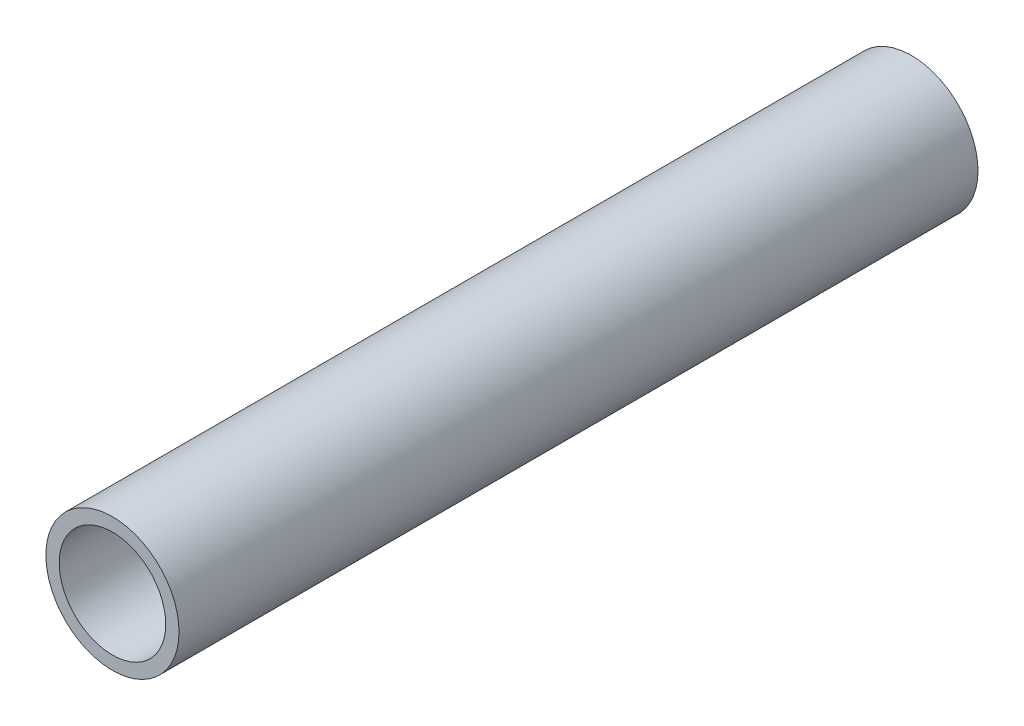
ISO-10303-21;
HEADER;
FILE_DESCRIPTION(('STEP AP214'),'2;1');
FILE_NAME('part.step','',(''),(''),'','','');
FILE_SCHEMA(('AUTOMOTIVE_DESIGN { 1 0 10303 214 1 1 1 1 }'));
ENDSEC;
DATA;
#1=APPLICATION_CONTEXT('core data for automotive mechanical design processes');
#2=APPLICATION_PROTOCOL_DEFINITION('international standard','automotive_design',2000,#1);
#3=PRODUCT_CONTEXT('',#1,'mechanical');
#4=PRODUCT('Part','Part','',(#3));
#5=PRODUCT_RELATED_PRODUCT_CATEGORY('part','',(#4));
#6=PRODUCT_DEFINITION_FORMATION('','',#4);
#7=PRODUCT_DEFINITION_CONTEXT('part definition',#1,'design');
#8=PRODUCT_DEFINITION('design','',#6,#7);
#9=PRODUCT_DEFINITION_SHAPE('','',#8);
#10=(LENGTH_UNIT() NAMED_UNIT(*) SI_UNIT(.MILLI.,.METRE.));
#11=(NAMED_UNIT(*) PLANE_ANGLE_UNIT() SI_UNIT($,.RADIAN.));
#12=(NAMED_UNIT(*) SI_UNIT($,.STERADIAN.) SOLID_ANGLE_UNIT());
#13=UNCERTAINTY_MEASURE_WITH_UNIT(LENGTH_MEASURE(1.E-05),#10,'distance_accuracy_value','');
#14=(GEOMETRIC_REPRESENTATION_CONTEXT(3) GLOBAL_UNCERTAINTY_ASSIGNED_CONTEXT((#13)) GLOBAL_UNIT_ASSIGNED_CONTEXT((#10,
#11,#12)) REPRESENTATION_CONTEXT('',''));
#15=CARTESIAN_POINT('',(0.,0.,0.));
#16=DIRECTION('',(0.,0.,1.));
#17=DIRECTION('',(1.,0.,0.));
#18=AXIS2_PLACEMENT_3D('',#15,#16,#17);
#19=CARTESIAN_POINT('',(0.,0.,150.));
#20=DIRECTION('',(0.,0.,1.));
#21=DIRECTION('',(1.,0.,0.));
#22=AXIS2_PLACEMENT_3D('',#19,#20,#21);
#23=PLANE('',#22);
#24=CARTESIAN_POINT('',(0.,0.,150.));
#25=DIRECTION('',(0.,0.,1.));
#26=DIRECTION('',(1.,0.,0.));
#27=AXIS2_PLACEMENT_3D('',#24,#25,#26);
#28=CIRCLE('',#27,12.5);
#29=CARTESIAN_POINT('',(12.5,0.,150.));
#30=VERTEX_POINT('',#29);
#31=EDGE_CURVE('E10',#30,#30,#28,.T.);
#32=ORIENTED_EDGE('',*,*,#31,.T.);
#33=EDGE_LOOP('',(#32));
#34=FACE_BOUND('',#33,.T.);
#35=CARTESIAN_POINT('',(0.,0.,150.));
#36=DIRECTION('',(0.,0.,1.));
#37=DIRECTION('',(1.,0.,0.));
#38=AXIS2_PLACEMENT_3D('',#35,#36,#37);
#39=CIRCLE('',#38,10.);
#40=CARTESIAN_POINT('',(10.,0.,150.));
#41=VERTEX_POINT('',#40);
#42=EDGE_CURVE('E52',#41,#41,#39,.T.);
#43=ORIENTED_EDGE('',*,*,#42,.F.);
#44=EDGE_LOOP('',(#43));
#45=FACE_BOUND('',#44,.T.);
#46=ADVANCED_FACE('F39',(#34,#45),#23,.T.);
#47=CARTESIAN_POINT('',(0.,0.,0.));
#48=DIRECTION('',(0.,0.,1.));
#49=DIRECTION('',(1.,0.,0.));
#50=AXIS2_PLACEMENT_3D('',#47,#48,#49);
#51=PLANE('',#50);
#52=CARTESIAN_POINT('',(0.,0.,0.));
#53=DIRECTION('',(0.,0.,1.));
#54=DIRECTION('',(1.,0.,0.));
#55=AXIS2_PLACEMENT_3D('',#52,#53,#54);
#56=CIRCLE('',#55,12.5);
#57=CARTESIAN_POINT('',(12.5,0.,0.));
#58=VERTEX_POINT('',#57);
#59=EDGE_CURVE('E43',#58,#58,#56,.T.);
#60=ORIENTED_EDGE('',*,*,#59,.F.);
#61=EDGE_LOOP('',(#60));
#62=FACE_BOUND('',#61,.T.);
#63=CARTESIAN_POINT('',(0.,0.,0.));
#64=DIRECTION('',(0.,0.,1.));
#65=DIRECTION('',(1.,0.,0.));
#66=AXIS2_PLACEMENT_3D('',#63,#64,#65);
#67=CIRCLE('',#66,10.);
#68=CARTESIAN_POINT('',(10.,0.,0.));
#69=VERTEX_POINT('',#68);
#70=EDGE_CURVE('E54',#69,#69,#67,.T.);
#71=ORIENTED_EDGE('',*,*,#70,.T.);
#72=EDGE_LOOP('',(#71));
#73=FACE_BOUND('',#72,.T.);
#74=ADVANCED_FACE('F66',(#62,#73),#51,.F.);
#75=CARTESIAN_POINT('',(0.,0.,150.));
#76=DIRECTION('',(0.,0.,-1.));
#77=DIRECTION('',(-1.,0.,0.));
#78=AXIS2_PLACEMENT_3D('',#75,#76,#77);
#79=CYLINDRICAL_SURFACE('',#78,12.5);
#80=ORIENTED_EDGE('',*,*,#31,.F.);
#81=EDGE_LOOP('',(#80));
#82=FACE_BOUND('',#81,.T.);
#83=ORIENTED_EDGE('',*,*,#59,.T.);
#84=EDGE_LOOP('',(#83));
#85=FACE_BOUND('',#84,.T.);
#86=ADVANCED_FACE('F41',(#82,#85),#79,.T.);
#87=CARTESIAN_POINT('',(0.,0.,150.));
#88=DIRECTION('',(0.,0.,-1.));
#89=DIRECTION('',(-1.,0.,0.));
#90=AXIS2_PLACEMENT_3D('',#87,#88,#89);
#91=CYLINDRICAL_SURFACE('',#90,10.);
#92=ORIENTED_EDGE('',*,*,#42,.T.);
#93=EDGE_LOOP('',(#92));
#94=FACE_BOUND('',#93,.T.);
#95=ORIENTED_EDGE('',*,*,#70,.F.);
#96=EDGE_LOOP('',(#95));
#97=FACE_BOUND('',#96,.T.);
#98=ADVANCED_FACE('F62',(#94,#97),#91,.F.);
#99=CLOSED_SHELL('',(#46,#74,#86,#98));
#100=MANIFOLD_SOLID_BREP('B2',#99);
#101=ADVANCED_BREP_SHAPE_REPRESENTATION('',(#18,#100),#14);
#102=SHAPE_DEFINITION_REPRESENTATION(#9,#101);
ENDSEC;
END-ISO-10303-21;
